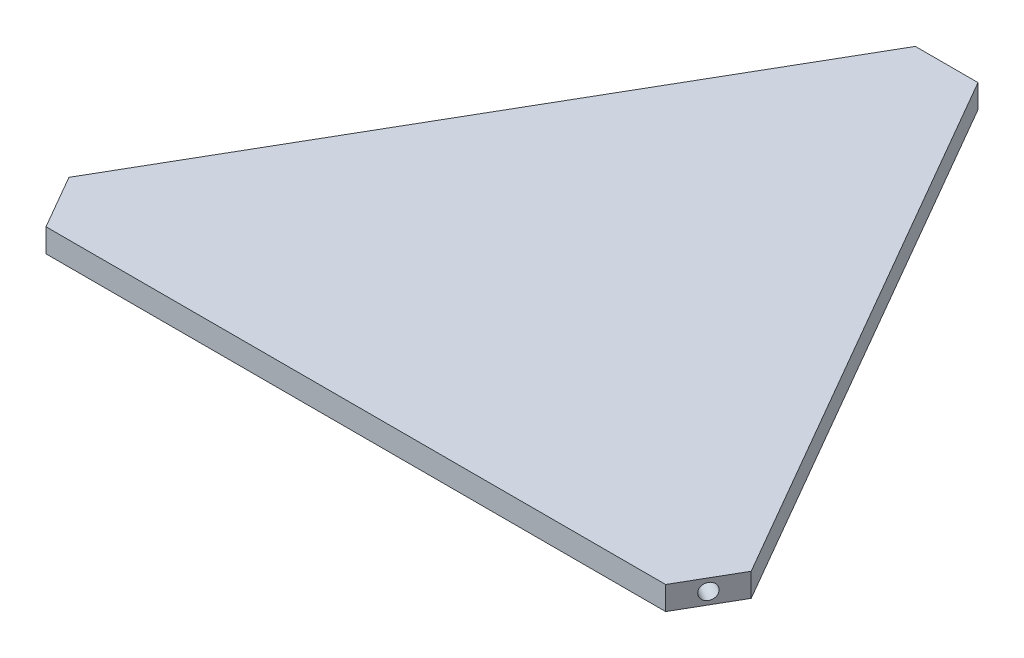
ISO-10303-21;
HEADER;
FILE_DESCRIPTION(('STEP AP214'),'2;1');
FILE_NAME('part.step','',(''),(''),'','','');
FILE_SCHEMA(('AUTOMOTIVE_DESIGN { 1 0 10303 214 1 1 1 1 }'));
ENDSEC;
DATA;
#1=APPLICATION_CONTEXT('core data for automotive mechanical design processes');
#2=APPLICATION_PROTOCOL_DEFINITION('international standard','automotive_design',2000,#1);
#3=PRODUCT_CONTEXT('',#1,'mechanical');
#4=PRODUCT('Part','Part','',(#3));
#5=PRODUCT_RELATED_PRODUCT_CATEGORY('part','',(#4));
#6=PRODUCT_DEFINITION_FORMATION('','',#4);
#7=PRODUCT_DEFINITION_CONTEXT('part definition',#1,'design');
#8=PRODUCT_DEFINITION('design','',#6,#7);
#9=PRODUCT_DEFINITION_SHAPE('','',#8);
#10=(LENGTH_UNIT() NAMED_UNIT(*) SI_UNIT(.MILLI.,.METRE.));
#11=(NAMED_UNIT(*) PLANE_ANGLE_UNIT() SI_UNIT($,.RADIAN.));
#12=(NAMED_UNIT(*) SI_UNIT($,.STERADIAN.) SOLID_ANGLE_UNIT());
#13=UNCERTAINTY_MEASURE_WITH_UNIT(LENGTH_MEASURE(1.E-05),#10,'distance_accuracy_value','');
#14=(GEOMETRIC_REPRESENTATION_CONTEXT(3) GLOBAL_UNCERTAINTY_ASSIGNED_CONTEXT((#13)) GLOBAL_UNIT_ASSIGNED_CONTEXT((#10,
#11,#12)) REPRESENTATION_CONTEXT('',''));
#15=CARTESIAN_POINT('',(0.,0.,0.));
#16=DIRECTION('',(0.,0.,1.));
#17=DIRECTION('',(1.,0.,0.));
#18=AXIS2_PLACEMENT_3D('',#15,#16,#17);
#19=CARTESIAN_POINT('',(12.7,4.7625,-152.4));
#20=DIRECTION('',(0.,0.,1.));
#21=DIRECTION('',(1.,0.,0.));
#22=AXIS2_PLACEMENT_3D('',#19,#20,#21);
#23=PLANE('',#22);
#24=CARTESIAN_POINT('',(-1.0547118733939E-12,0.,-152.4));
#25=DIRECTION('',(0.,0.,-1.));
#26=DIRECTION('',(-1.,0.,0.));
#27=AXIS2_PLACEMENT_3D('',#24,#25,#26);
#28=CIRCLE('',#27,3.17499999999999);
#29=CARTESIAN_POINT('',(-3.17500000000104,0.,-152.4));
#30=VERTEX_POINT('',#29);
#31=EDGE_CURVE('E165',#30,#30,#28,.T.);
#32=ORIENTED_EDGE('',*,*,#31,.F.);
#33=EDGE_LOOP('',(#32));
#34=FACE_BOUND('',#33,.T.);
#35=DIRECTION('',(-1.,0.,0.));
#36=VECTOR('',#35,1.);
#37=CARTESIAN_POINT('',(12.7,-4.7625,-152.4));
#38=LINE('',#37,#36);
#39=CARTESIAN_POINT('',(12.7,-4.7625,-152.4));
#40=VERTEX_POINT('',#39);
#41=CARTESIAN_POINT('',(-12.7,-4.7625,-152.4));
#42=VERTEX_POINT('',#41);
#43=EDGE_CURVE('E122',#40,#42,#38,.T.);
#44=ORIENTED_EDGE('',*,*,#43,.T.);
#45=DIRECTION('',(0.,-1.,0.));
#46=VECTOR('',#45,1.);
#47=CARTESIAN_POINT('',(-12.7,4.7625,-152.4));
#48=LINE('',#47,#46);
#49=CARTESIAN_POINT('',(-12.7,4.7625,-152.4));
#50=VERTEX_POINT('',#49);
#51=EDGE_CURVE('E11',#50,#42,#48,.T.);
#52=ORIENTED_EDGE('',*,*,#51,.F.);
#53=DIRECTION('',(-1.,0.,0.));
#54=VECTOR('',#53,1.);
#55=CARTESIAN_POINT('',(12.7,4.7625,-152.4));
#56=LINE('',#55,#54);
#57=CARTESIAN_POINT('',(12.7,4.7625,-152.4));
#58=VERTEX_POINT('',#57);
#59=EDGE_CURVE('E133',#58,#50,#56,.T.);
#60=ORIENTED_EDGE('',*,*,#59,.F.);
#61=DIRECTION('',(0.,-1.,0.));
#62=VECTOR('',#61,1.);
#63=CARTESIAN_POINT('',(12.7,4.7625,-152.4));
#64=LINE('',#63,#62);
#65=EDGE_CURVE('E118',#58,#40,#64,.T.);
#66=ORIENTED_EDGE('',*,*,#65,.T.);
#67=EDGE_LOOP('',(#44,#52,#60,#66));
#68=FACE_BOUND('',#67,.T.);
#69=ADVANCED_FACE('F35',(#34,#68),#23,.F.);
#70=CARTESIAN_POINT('',(-12.7,4.7625,-152.4));
#71=DIRECTION('',(0.866025403784438,0.,0.500000000000001));
#72=DIRECTION('',(0.500000000000001,0.,-0.866025403784438));
#73=AXIS2_PLACEMENT_3D('',#70,#71,#72);
#74=PLANE('',#73);
#75=DIRECTION('',(-0.500000000000001,0.,0.866025403784438));
#76=VECTOR('',#75,1.);
#77=CARTESIAN_POINT('',(-12.7,-4.7625,-152.4));
#78=LINE('',#77,#76);
#79=CARTESIAN_POINT('',(-138.332271536749,-4.7625,65.2014773719373));
#80=VERTEX_POINT('',#79);
#81=EDGE_CURVE('E125',#42,#80,#78,.T.);
#82=ORIENTED_EDGE('',*,*,#81,.T.);
#83=DIRECTION('',(0.,-1.,0.));
#84=VECTOR('',#83,1.);
#85=CARTESIAN_POINT('',(-138.332271536749,4.7625,65.2014773719373));
#86=LINE('',#85,#84);
#87=CARTESIAN_POINT('',(-138.332271536749,4.7625,65.2014773719373));
#88=VERTEX_POINT('',#87);
#89=EDGE_CURVE('E43',#88,#80,#86,.T.);
#90=ORIENTED_EDGE('',*,*,#89,.F.);
#91=DIRECTION('',(-0.500000000000001,0.,0.866025403784438));
#92=VECTOR('',#91,1.);
#93=CARTESIAN_POINT('',(-12.7,4.7625,-152.4));
#94=LINE('',#93,#92);
#95=EDGE_CURVE('E89',#50,#88,#94,.T.);
#96=ORIENTED_EDGE('',*,*,#95,.F.);
#97=ORIENTED_EDGE('',*,*,#51,.T.);
#98=EDGE_LOOP('',(#82,#90,#96,#97));
#99=FACE_BOUND('',#98,.T.);
#100=ADVANCED_FACE('F158',(#99),#74,.F.);
#101=CARTESIAN_POINT('',(-138.332271536749,4.7625,65.2014773719373));
#102=DIRECTION('',(0.86602540378444,0.,-0.499999999999998));
#103=DIRECTION('',(-0.499999999999998,0.,-0.86602540378444));
#104=AXIS2_PLACEMENT_3D('',#101,#102,#103);
#105=PLANE('',#104);
#106=CARTESIAN_POINT('',(-131.982271536748,0.,76.2000000000015));
#107=DIRECTION('',(-0.866025403784433,0.,0.50000000000001));
#108=DIRECTION('',(0.50000000000001,0.,0.866025403784433));
#109=AXIS2_PLACEMENT_3D('',#106,#107,#108);
#110=CIRCLE('',#109,3.17499999999999);
#111=CARTESIAN_POINT('',(-130.394771536748,0.,78.9496306570171));
#112=VERTEX_POINT('',#111);
#113=EDGE_CURVE('E174',#112,#112,#110,.T.);
#114=ORIENTED_EDGE('',*,*,#113,.F.);
#115=EDGE_LOOP('',(#114));
#116=FACE_BOUND('',#115,.T.);
#117=DIRECTION('',(0.499999999999998,0.,0.86602540378444));
#118=VECTOR('',#117,1.);
#119=CARTESIAN_POINT('',(-138.332271536749,-4.7625,65.2014773719373));
#120=LINE('',#119,#118);
#121=CARTESIAN_POINT('',(-125.632271536749,-4.7625,87.1985226280621));
#122=VERTEX_POINT('',#121);
#123=EDGE_CURVE('E128',#80,#122,#120,.T.);
#124=ORIENTED_EDGE('',*,*,#123,.T.);
#125=DIRECTION('',(0.,-1.,0.));
#126=VECTOR('',#125,1.);
#127=CARTESIAN_POINT('',(-125.632271536749,4.7625,87.1985226280621));
#128=LINE('',#127,#126);
#129=CARTESIAN_POINT('',(-125.632271536749,4.7625,87.1985226280621));
#130=VERTEX_POINT('',#129);
#131=EDGE_CURVE('E113',#130,#122,#128,.T.);
#132=ORIENTED_EDGE('',*,*,#131,.F.);
#133=DIRECTION('',(0.499999999999998,0.,0.86602540378444));
#134=VECTOR('',#133,1.);
#135=CARTESIAN_POINT('',(-138.332271536749,4.7625,65.2014773719373));
#136=LINE('',#135,#134);
#137=EDGE_CURVE('E104',#88,#130,#136,.T.);
#138=ORIENTED_EDGE('',*,*,#137,.F.);
#139=ORIENTED_EDGE('',*,*,#89,.T.);
#140=EDGE_LOOP('',(#124,#132,#138,#139));
#141=FACE_BOUND('',#140,.T.);
#142=ADVANCED_FACE('F139',(#116,#141),#105,.F.);
#143=CARTESIAN_POINT('',(-125.632271536749,4.7625,87.1985226280621));
#144=DIRECTION('',(0.,0.,-1.));
#145=DIRECTION('',(-1.,0.,0.));
#146=AXIS2_PLACEMENT_3D('',#143,#144,#145);
#147=PLANE('',#146);
#148=DIRECTION('',(1.,0.,0.));
#149=VECTOR('',#148,1.);
#150=CARTESIAN_POINT('',(-125.632271536749,-4.7625,87.1985226280621));
#151=LINE('',#150,#149);
#152=CARTESIAN_POINT('',(125.632271536749,-4.7625,87.1985226280621));
#153=VERTEX_POINT('',#152);
#154=EDGE_CURVE('E112',#122,#153,#151,.T.);
#155=ORIENTED_EDGE('',*,*,#154,.T.);
#156=DIRECTION('',(0.,-1.,0.));
#157=VECTOR('',#156,1.);
#158=CARTESIAN_POINT('',(125.632271536749,4.7625,87.1985226280621));
#159=LINE('',#158,#157);
#160=CARTESIAN_POINT('',(125.632271536749,4.7625,87.1985226280621));
#161=VERTEX_POINT('',#160);
#162=EDGE_CURVE('E109',#161,#153,#159,.T.);
#163=ORIENTED_EDGE('',*,*,#162,.F.);
#164=DIRECTION('',(1.,0.,0.));
#165=VECTOR('',#164,1.);
#166=CARTESIAN_POINT('',(-125.632271536749,4.7625,87.1985226280621));
#167=LINE('',#166,#165);
#168=EDGE_CURVE('E98',#130,#161,#167,.T.);
#169=ORIENTED_EDGE('',*,*,#168,.F.);
#170=ORIENTED_EDGE('',*,*,#131,.T.);
#171=EDGE_LOOP('',(#155,#163,#169,#170));
#172=FACE_BOUND('',#171,.T.);
#173=ADVANCED_FACE('F110',(#172),#147,.F.);
#174=CARTESIAN_POINT('',(138.332271536749,4.7625,65.2014773719373));
#175=DIRECTION('',(-0.86602540378444,0.,-0.499999999999998));
#176=DIRECTION('',(-0.499999999999998,0.,0.86602540378444));
#177=AXIS2_PLACEMENT_3D('',#174,#175,#176);
#178=PLANE('',#177);
#179=CARTESIAN_POINT('',(131.982271536749,0.,76.1999999999997));
#180=DIRECTION('',(0.86602540378444,0.,0.499999999999998));
#181=DIRECTION('',(0.499999999999998,0.,-0.86602540378444));
#182=AXIS2_PLACEMENT_3D('',#179,#180,#181);
#183=CIRCLE('',#182,3.17499999999999);
#184=CARTESIAN_POINT('',(133.569771536749,0.,73.4503693429841));
#185=VERTEX_POINT('',#184);
#186=EDGE_CURVE('E171',#185,#185,#183,.T.);
#187=ORIENTED_EDGE('',*,*,#186,.F.);
#188=EDGE_LOOP('',(#187));
#189=FACE_BOUND('',#188,.T.);
#190=DIRECTION('',(0.499999999999998,0.,-0.86602540378444));
#191=VECTOR('',#190,1.);
#192=CARTESIAN_POINT('',(138.332271536749,-4.7625,65.2014773719373));
#193=LINE('',#192,#191);
#194=CARTESIAN_POINT('',(138.332271536749,-4.7625,65.2014773719373));
#195=VERTEX_POINT('',#194);
#196=EDGE_CURVE('E75',#153,#195,#193,.T.);
#197=ORIENTED_EDGE('',*,*,#196,.T.);
#198=DIRECTION('',(0.,-1.,0.));
#199=VECTOR('',#198,1.);
#200=CARTESIAN_POINT('',(138.332271536749,4.7625,65.2014773719373));
#201=LINE('',#200,#199);
#202=CARTESIAN_POINT('',(138.332271536749,4.7625,65.2014773719373));
#203=VERTEX_POINT('',#202);
#204=EDGE_CURVE('E114',#203,#195,#201,.T.);
#205=ORIENTED_EDGE('',*,*,#204,.F.);
#206=DIRECTION('',(0.499999999999998,0.,-0.86602540378444));
#207=VECTOR('',#206,1.);
#208=CARTESIAN_POINT('',(138.332271536749,4.7625,65.2014773719373));
#209=LINE('',#208,#207);
#210=EDGE_CURVE('E102',#161,#203,#209,.T.);
#211=ORIENTED_EDGE('',*,*,#210,.F.);
#212=ORIENTED_EDGE('',*,*,#162,.T.);
#213=EDGE_LOOP('',(#197,#205,#211,#212));
#214=FACE_BOUND('',#213,.T.);
#215=ADVANCED_FACE('F116',(#189,#214),#178,.F.);
#216=CARTESIAN_POINT('',(138.332271536749,4.7625,65.2014773719373));
#217=DIRECTION('',(-0.866025403784438,0.,0.500000000000001));
#218=DIRECTION('',(0.500000000000001,0.,0.866025403784438));
#219=AXIS2_PLACEMENT_3D('',#216,#217,#218);
#220=PLANE('',#219);
#221=DIRECTION('',(-0.500000000000001,0.,-0.866025403784438));
#222=VECTOR('',#221,1.);
#223=CARTESIAN_POINT('',(138.332271536749,-4.7625,65.2014773719373));
#224=LINE('',#223,#222);
#225=EDGE_CURVE('E81',#195,#40,#224,.T.);
#226=ORIENTED_EDGE('',*,*,#225,.T.);
#227=ORIENTED_EDGE('',*,*,#65,.F.);
#228=DIRECTION('',(-0.500000000000001,0.,-0.866025403784438));
#229=VECTOR('',#228,1.);
#230=CARTESIAN_POINT('',(138.332271536749,4.7625,65.2014773719373));
#231=LINE('',#230,#229);
#232=EDGE_CURVE('E51',#203,#58,#231,.T.);
#233=ORIENTED_EDGE('',*,*,#232,.F.);
#234=ORIENTED_EDGE('',*,*,#204,.T.);
#235=EDGE_LOOP('',(#226,#227,#233,#234));
#236=FACE_BOUND('',#235,.T.);
#237=ADVANCED_FACE('F146',(#236),#220,.F.);
#238=CARTESIAN_POINT('',(0.,4.7625,0.));
#239=DIRECTION('',(0.,1.,0.));
#240=DIRECTION('',(0.,0.,1.));
#241=AXIS2_PLACEMENT_3D('',#238,#239,#240);
#242=PLANE('',#241);
#243=ORIENTED_EDGE('',*,*,#59,.T.);
#244=ORIENTED_EDGE('',*,*,#95,.T.);
#245=ORIENTED_EDGE('',*,*,#137,.T.);
#246=ORIENTED_EDGE('',*,*,#168,.T.);
#247=ORIENTED_EDGE('',*,*,#210,.T.);
#248=ORIENTED_EDGE('',*,*,#232,.T.);
#249=EDGE_LOOP('',(#243,#244,#245,#246,#247,#248));
#250=FACE_BOUND('',#249,.T.);
#251=ADVANCED_FACE('F100',(#250),#242,.T.);
#252=CARTESIAN_POINT('',(0.,-4.7625,0.));
#253=DIRECTION('',(0.,1.,0.));
#254=DIRECTION('',(0.,0.,1.));
#255=AXIS2_PLACEMENT_3D('',#252,#253,#254);
#256=PLANE('',#255);
#257=ORIENTED_EDGE('',*,*,#43,.F.);
#258=ORIENTED_EDGE('',*,*,#225,.F.);
#259=ORIENTED_EDGE('',*,*,#196,.F.);
#260=ORIENTED_EDGE('',*,*,#154,.F.);
#261=ORIENTED_EDGE('',*,*,#123,.F.);
#262=ORIENTED_EDGE('',*,*,#81,.F.);
#263=EDGE_LOOP('',(#257,#258,#259,#260,#261,#262));
#264=FACE_BOUND('',#263,.T.);
#265=ADVANCED_FACE('F142',(#264),#256,.F.);
#266=CARTESIAN_POINT('',(120.983748908686,0.,69.8499999999997));
#267=DIRECTION('',(0.86602540378444,0.,0.499999999999998));
#268=DIRECTION('',(0.499999999999998,0.,-0.86602540378444));
#269=AXIS2_PLACEMENT_3D('',#266,#267,#268);
#270=CONICAL_SURFACE('',#269,3.17499999999999,1.02974425867666);
#271=CARTESIAN_POINT('',(119.331604130015,0.,68.8961337672935));
#272=VERTEX_POINT('',#271);
#273=VERTEX_LOOP('',#272);
#274=FACE_BOUND('',#273,.T.);
#275=CARTESIAN_POINT('',(120.983748908686,0.,69.8499999999997));
#276=DIRECTION('',(0.86602540378444,0.,0.499999999999998));
#277=DIRECTION('',(0.499999999999998,0.,-0.86602540378444));
#278=AXIS2_PLACEMENT_3D('',#275,#276,#277);
#279=CIRCLE('',#278,3.17499999999999);
#280=CARTESIAN_POINT('',(122.571248908686,0.,67.1003693429842));
#281=VERTEX_POINT('',#280);
#282=EDGE_CURVE('E126',#281,#281,#279,.T.);
#283=ORIENTED_EDGE('',*,*,#282,.T.);
#284=EDGE_LOOP('',(#283));
#285=FACE_BOUND('',#284,.T.);
#286=ADVANCED_FACE('F185',(#274,#285),#270,.F.);
#287=CARTESIAN_POINT('',(131.982271536749,0.,76.1999999999997));
#288=DIRECTION('',(0.86602540378444,0.,0.499999999999998));
#289=DIRECTION('',(0.499999999999998,0.,-0.86602540378444));
#290=AXIS2_PLACEMENT_3D('',#287,#288,#289);
#291=CYLINDRICAL_SURFACE('',#290,3.17499999999999);
#292=CARTESIAN_POINT('',(122.571248908686,0.,67.1003693429842));
#293=CARTESIAN_POINT('',(122.685816852729,0.,67.1665151763175));
#294=CARTESIAN_POINT('',(122.800384796771,0.,67.2326610096508));
#295=CARTESIAN_POINT('',(123.029520684856,0.,67.3649526763175));
#296=CARTESIAN_POINT('',(123.144088628898,0.,67.4310985096508));
#297=CARTESIAN_POINT('',(123.373224516982,0.,67.5633901763175));
#298=CARTESIAN_POINT('',(123.487792461025,0.,67.6295360096508));
#299=CARTESIAN_POINT('',(123.716928349109,0.,67.7618276763175));
#300=CARTESIAN_POINT('',(123.831496293152,0.,67.8279735096508));
#301=CARTESIAN_POINT('',(124.060632181236,0.,67.9602651763175));
#302=CARTESIAN_POINT('',(124.175200125279,0.,68.0264110096508));
#303=CARTESIAN_POINT('',(124.404336013363,0.,68.1587026763175));
#304=CARTESIAN_POINT('',(124.518903957406,0.,68.2248485096508));
#305=CARTESIAN_POINT('',(124.74803984549,0.,68.3571401763175));
#306=CARTESIAN_POINT('',(124.862607789533,0.,68.4232860096508));
#307=CARTESIAN_POINT('',(125.091743677617,0.,68.5555776763175));
#308=CARTESIAN_POINT('',(125.20631162166,0.,68.6217235096508));
#309=CARTESIAN_POINT('',(125.435447509744,0.,68.7540151763175));
#310=CARTESIAN_POINT('',(125.550015453786,0.,68.8201610096508));
#311=CARTESIAN_POINT('',(125.779151341871,0.,68.9524526763175));
#312=CARTESIAN_POINT('',(125.893719285913,0.,69.0185985096508));
#313=CARTESIAN_POINT('',(126.122855173998,0.,69.1508901763175));
#314=CARTESIAN_POINT('',(126.23742311804,0.,69.2170360096508));
#315=CARTESIAN_POINT('',(126.466559006125,0.,69.3493276763175));
#316=CARTESIAN_POINT('',(126.581126950167,0.,69.4154735096508));
#317=CARTESIAN_POINT('',(126.810262838252,0.,69.5477651763175));
#318=CARTESIAN_POINT('',(126.924830782294,0.,69.6139110096508));
#319=CARTESIAN_POINT('',(127.153966670379,0.,69.7462026763175));
#320=CARTESIAN_POINT('',(127.268534614421,0.,69.8123485096508));
#321=CARTESIAN_POINT('',(127.497670502506,0.,69.9446401763175));
#322=CARTESIAN_POINT('',(127.612238446548,0.,70.0107860096508));
#323=CARTESIAN_POINT('',(127.841374334633,0.,70.1430776763175));
#324=CARTESIAN_POINT('',(127.955942278675,0.,70.2092235096508));
#325=CARTESIAN_POINT('',(128.18507816676,0.,70.3415151763175));
#326=CARTESIAN_POINT('',(128.299646110802,0.,70.4076610096508));
#327=CARTESIAN_POINT('',(128.528781998887,0.,70.5399526763175));
#328=CARTESIAN_POINT('',(128.643349942929,0.,70.6060985096508));
#329=CARTESIAN_POINT('',(128.872485831014,0.,70.7383901763175));
#330=CARTESIAN_POINT('',(128.987053775056,0.,70.8045360096508));
#331=CARTESIAN_POINT('',(129.216189663141,0.,70.9368276763175));
#332=CARTESIAN_POINT('',(129.330757607183,0.,71.0029735096508));
#333=CARTESIAN_POINT('',(129.559893495268,0.,71.1352651763175));
#334=CARTESIAN_POINT('',(129.67446143931,0.,71.2014110096508));
#335=CARTESIAN_POINT('',(129.903597327395,0.,71.3337026763175));
#336=CARTESIAN_POINT('',(130.018165271437,0.,71.3998485096508));
#337=CARTESIAN_POINT('',(130.247301159521,0.,71.5321401763175));
#338=CARTESIAN_POINT('',(130.361869103564,0.,71.5982860096508));
#339=CARTESIAN_POINT('',(130.591004991648,0.,71.7305776763175));
#340=CARTESIAN_POINT('',(130.705572935691,0.,71.7967235096508));
#341=CARTESIAN_POINT('',(130.934708823775,0.,71.9290151763175));
#342=CARTESIAN_POINT('',(131.049276767818,0.,71.9951610096508));
#343=CARTESIAN_POINT('',(131.278412655902,0.,72.1274526763175));
#344=CARTESIAN_POINT('',(131.392980599945,0.,72.1935985096508));
#345=CARTESIAN_POINT('',(131.622116488029,0.,72.3258901763175));
#346=CARTESIAN_POINT('',(131.736684432072,0.,72.3920360096508));
#347=CARTESIAN_POINT('',(131.965820320156,0.,72.5243276763175));
#348=CARTESIAN_POINT('',(132.080388264199,0.,72.5904735096508));
#349=CARTESIAN_POINT('',(132.309524152283,0.,72.7227651763175));
#350=CARTESIAN_POINT('',(132.424092096325,0.,72.7889110096508));
#351=CARTESIAN_POINT('',(132.65322798441,0.,72.9212026763175));
#352=CARTESIAN_POINT('',(132.767795928452,0.,72.9873485096508));
#353=CARTESIAN_POINT('',(132.996931816537,0.,73.1196401763175));
#354=CARTESIAN_POINT('',(133.111499760579,0.,73.1857860096508));
#355=CARTESIAN_POINT('',(133.340635648664,0.,73.3180776763175));
#356=CARTESIAN_POINT('',(133.455203592706,0.,73.3842235096508));
#357=CARTESIAN_POINT('',(133.569771536749,0.,73.4503693429841));
#358=B_SPLINE_CURVE_WITH_KNOTS('',3,(#292,#293,#294,#295,#296,#297,#298,#299,#300,#301,#302,
#303,#304,#305,#306,#307,#308,#309,#310,#311,#312,#313,#314,#315,#316,#317,#318,#319,#320,#321,
#322,#323,#324,#325,#326,#327,#328,#329,#330,#331,#332,#333,#334,#335,#336,#337,#338,#339,#340,
#341,#342,#343,#344,#345,#346,#347,#348,#349,#350,#351,#352,#353,#354,#355,#356,#357),
.UNSPECIFIED.,.F.,.F.,(4,2,2,2,2,2,2,2,2,2,2,2,2,2,2,2,2,2,2,2,2,2,2,2,2,2,2,2,2,2,2,2,4),(0.,
0.396875,0.79375,1.19062500000001,1.58750000000001,1.98437500000001,2.38125000000001,2.778125,
3.175,3.571875,3.96875000000001,4.36562500000001,4.76250000000001,5.15937500000001,
5.55625000000001,5.95312500000001,6.35000000000001,6.74687500000001,7.14374999999999,
7.54062499999999,7.93749999999999,8.334375,8.73125,9.128125,9.525,9.92187500000001,10.31875,
10.715625,11.1125,11.509375,11.90625,12.303125,12.7),.UNSPECIFIED.);
#359=EDGE_CURVE('BSEAM187',#281,#185,#358,.T.);
#360=ORIENTED_EDGE('',*,*,#282,.F.);
#361=ORIENTED_EDGE('',*,*,#186,.T.);
#362=ORIENTED_EDGE('',*,*,#359,.T.);
#363=ORIENTED_EDGE('',*,*,#359,.F.);
#364=EDGE_LOOP('',(#360,#362,#361,#363));
#365=FACE_BOUND('',#364,.T.);
#366=ADVANCED_FACE('F187',(#365),#291,.F.);
#367=CARTESIAN_POINT('',(-1.0547118733939E-12,0.,-139.7));
#368=DIRECTION('',(0.,0.,-1.));
#369=DIRECTION('',(-1.,0.,0.));
#370=AXIS2_PLACEMENT_3D('',#367,#368,#369);
#371=CONICAL_SURFACE('',#370,3.17499999999999,1.02974425867666);
#372=CARTESIAN_POINT('',(-1.05828973595521E-12,0.,-137.792267534588));
#373=VERTEX_POINT('',#372);
#374=VERTEX_LOOP('',#373);
#375=FACE_BOUND('',#374,.T.);
#376=CARTESIAN_POINT('',(-1.0547118733939E-12,0.,-139.7));
#377=DIRECTION('',(0.,0.,-1.));
#378=DIRECTION('',(-1.,0.,0.));
#379=AXIS2_PLACEMENT_3D('',#376,#377,#378);
#380=CIRCLE('',#379,3.17499999999999);
#381=CARTESIAN_POINT('',(-3.17500000000104,0.,-139.7));
#382=VERTEX_POINT('',#381);
#383=EDGE_CURVE('E167',#382,#382,#380,.T.);
#384=ORIENTED_EDGE('',*,*,#383,.T.);
#385=EDGE_LOOP('',(#384));
#386=FACE_BOUND('',#385,.T.);
#387=ADVANCED_FACE('F190',(#375,#386),#371,.F.);
#388=CARTESIAN_POINT('',(-1.0547118733939E-12,0.,-152.4));
#389=DIRECTION('',(0.,0.,-1.));
#390=DIRECTION('',(-1.,0.,0.));
#391=AXIS2_PLACEMENT_3D('',#388,#389,#390);
#392=CYLINDRICAL_SURFACE('',#391,3.17499999999999);
#393=ORIENTED_EDGE('',*,*,#383,.F.);
#394=EDGE_LOOP('',(#393));
#395=FACE_BOUND('',#394,.T.);
#396=ORIENTED_EDGE('',*,*,#31,.T.);
#397=EDGE_LOOP('',(#396));
#398=FACE_BOUND('',#397,.T.);
#399=ADVANCED_FACE('F197',(#395,#398),#392,.F.);
#400=CARTESIAN_POINT('',(-120.983748908685,0.,69.8500000000014));
#401=DIRECTION('',(-0.866025403784433,0.,0.50000000000001));
#402=DIRECTION('',(0.50000000000001,0.,0.866025403784433));
#403=AXIS2_PLACEMENT_3D('',#400,#401,#402);
#404=CONICAL_SURFACE('',#403,3.17499999999999,1.02974425867666);
#405=CARTESIAN_POINT('',(-119.331604130014,0.,68.8961337672952));
#406=VERTEX_POINT('',#405);
#407=VERTEX_LOOP('',#406);
#408=FACE_BOUND('',#407,.T.);
#409=CARTESIAN_POINT('',(-120.983748908685,0.,69.8500000000014));
#410=DIRECTION('',(-0.866025403784433,0.,0.50000000000001));
#411=DIRECTION('',(0.50000000000001,0.,0.866025403784433));
#412=AXIS2_PLACEMENT_3D('',#409,#410,#411);
#413=CIRCLE('',#412,3.17499999999999);
#414=CARTESIAN_POINT('',(-119.396248908685,0.,72.599630657017));
#415=VERTEX_POINT('',#414);
#416=EDGE_CURVE('E168',#415,#415,#413,.T.);
#417=ORIENTED_EDGE('',*,*,#416,.T.);
#418=EDGE_LOOP('',(#417));
#419=FACE_BOUND('',#418,.T.);
#420=ADVANCED_FACE('F250',(#408,#419),#404,.F.);
#421=CARTESIAN_POINT('',(-131.982271536748,0.,76.2000000000015));
#422=DIRECTION('',(-0.866025403784433,0.,0.50000000000001));
#423=DIRECTION('',(0.50000000000001,0.,0.866025403784433));
#424=AXIS2_PLACEMENT_3D('',#421,#422,#423);
#425=CYLINDRICAL_SURFACE('',#424,3.17499999999999);
#426=CARTESIAN_POINT('',(-119.396248908685,0.,72.599630657017));
#427=CARTESIAN_POINT('',(-119.510816852728,0.,72.6657764903503));
#428=CARTESIAN_POINT('',(-119.62538479677,0.,72.7319223236836));
#429=CARTESIAN_POINT('',(-119.854520684854,0.,72.8642139903503));
#430=CARTESIAN_POINT('',(-119.969088628897,0.,72.9303598236836));
#431=CARTESIAN_POINT('',(-120.198224516981,0.,73.0626514903503));
#432=CARTESIAN_POINT('',(-120.312792461024,0.,73.1287973236837));
#433=CARTESIAN_POINT('',(-120.541928349108,0.,73.2610889903503));
#434=CARTESIAN_POINT('',(-120.656496293151,0.,73.3272348236837));
#435=CARTESIAN_POINT('',(-120.885632181235,0.,73.4595264903503));
#436=CARTESIAN_POINT('',(-121.000200125278,0.,73.5256723236837));
#437=CARTESIAN_POINT('',(-121.229336013362,0.,73.6579639903503));
#438=CARTESIAN_POINT('',(-121.343903957405,0.,73.7241098236837));
#439=CARTESIAN_POINT('',(-121.573039845489,0.,73.8564014903503));
#440=CARTESIAN_POINT('',(-121.687607789532,0.,73.9225473236837));
#441=CARTESIAN_POINT('',(-121.916743677616,0.,74.0548389903503));
#442=CARTESIAN_POINT('',(-122.031311621659,0.,74.1209848236837));
#443=CARTESIAN_POINT('',(-122.260447509743,0.,74.2532764903503));
#444=CARTESIAN_POINT('',(-122.375015453785,0.,74.3194223236837));
#445=CARTESIAN_POINT('',(-122.60415134187,0.,74.4517139903503));
#446=CARTESIAN_POINT('',(-122.718719285912,0.,74.5178598236837));
#447=CARTESIAN_POINT('',(-122.947855173997,0.,74.6501514903504));
#448=CARTESIAN_POINT('',(-123.062423118039,0.,74.7162973236837));
#449=CARTESIAN_POINT('',(-123.291559006124,0.,74.8485889903504));
#450=CARTESIAN_POINT('',(-123.406126950166,0.,74.9147348236837));
#451=CARTESIAN_POINT('',(-123.635262838251,0.,75.0470264903504));
#452=CARTESIAN_POINT('',(-123.749830782293,0.,75.1131723236837));
#453=CARTESIAN_POINT('',(-123.978966670378,0.,75.2454639903504));
#454=CARTESIAN_POINT('',(-124.09353461442,0.,75.3116098236837));
#455=CARTESIAN_POINT('',(-124.322670502505,0.,75.4439014903504));
#456=CARTESIAN_POINT('',(-124.437238446547,0.,75.5100473236837));
#457=CARTESIAN_POINT('',(-124.666374334632,0.,75.6423389903504));
#458=CARTESIAN_POINT('',(-124.780942278674,0.,75.7084848236837));
#459=CARTESIAN_POINT('',(-125.010078166759,0.,75.8407764903504));
#460=CARTESIAN_POINT('',(-125.124646110801,0.,75.9069223236837));
#461=CARTESIAN_POINT('',(-125.353781998886,0.,76.0392139903504));
#462=CARTESIAN_POINT('',(-125.468349942928,0.,76.1053598236837));
#463=CARTESIAN_POINT('',(-125.697485831013,0.,76.2376514903504));
#464=CARTESIAN_POINT('',(-125.812053775055,0.,76.3037973236837));
#465=CARTESIAN_POINT('',(-126.04118966314,0.,76.4360889903504));
#466=CARTESIAN_POINT('',(-126.155757607182,0.,76.5022348236837));
#467=CARTESIAN_POINT('',(-126.384893495266,0.,76.6345264903504));
#468=CARTESIAN_POINT('',(-126.499461439309,0.,76.7006723236837));
#469=CARTESIAN_POINT('',(-126.728597327393,0.,76.8329639903504));
#470=CARTESIAN_POINT('',(-126.843165271436,0.,76.8991098236837));
#471=CARTESIAN_POINT('',(-127.07230115952,0.,77.0314014903504));
#472=CARTESIAN_POINT('',(-127.186869103563,0.,77.0975473236837));
#473=CARTESIAN_POINT('',(-127.416004991647,0.,77.2298389903504));
#474=CARTESIAN_POINT('',(-127.53057293569,0.,77.2959848236837));
#475=CARTESIAN_POINT('',(-127.759708823774,0.,77.4282764903504));
#476=CARTESIAN_POINT('',(-127.874276767817,0.,77.4944223236837));
#477=CARTESIAN_POINT('',(-128.103412655901,0.,77.6267139903504));
#478=CARTESIAN_POINT('',(-128.217980599944,0.,77.6928598236837));
#479=CARTESIAN_POINT('',(-128.447116488028,0.,77.8251514903504));
#480=CARTESIAN_POINT('',(-128.56168443207,0.,77.8912973236837));
#481=CARTESIAN_POINT('',(-128.790820320155,0.,78.0235889903504));
#482=CARTESIAN_POINT('',(-128.905388264197,0.,78.0897348236838));
#483=CARTESIAN_POINT('',(-129.134524152282,0.,78.2220264903504));
#484=CARTESIAN_POINT('',(-129.249092096324,0.,78.2881723236838));
#485=CARTESIAN_POINT('',(-129.478227984409,0.,78.4204639903504));
#486=CARTESIAN_POINT('',(-129.592795928451,0.,78.4866098236838));
#487=CARTESIAN_POINT('',(-129.821931816536,0.,78.6189014903504));
#488=CARTESIAN_POINT('',(-129.936499760578,0.,78.6850473236838));
#489=CARTESIAN_POINT('',(-130.165635648663,0.,78.8173389903504));
#490=CARTESIAN_POINT('',(-130.280203592705,0.,78.8834848236838));
#491=CARTESIAN_POINT('',(-130.394771536748,0.,78.9496306570171));
#492=B_SPLINE_CURVE_WITH_KNOTS('',3,(#426,#427,#428,#429,#430,#431,#432,#433,#434,#435,#436,
#437,#438,#439,#440,#441,#442,#443,#444,#445,#446,#447,#448,#449,#450,#451,#452,#453,#454,#455,
#456,#457,#458,#459,#460,#461,#462,#463,#464,#465,#466,#467,#468,#469,#470,#471,#472,#473,#474,
#475,#476,#477,#478,#479,#480,#481,#482,#483,#484,#485,#486,#487,#488,#489,#490,#491),
.UNSPECIFIED.,.F.,.F.,(4,2,2,2,2,2,2,2,2,2,2,2,2,2,2,2,2,2,2,2,2,2,2,2,2,2,2,2,2,2,2,2,4),(0.,
0.396874999999988,0.793749999999994,1.19062499999999,1.58749999999999,1.984375,2.38125,
2.77812499999999,3.175,3.571875,3.96874999999999,4.365625,4.7625,5.15937499999999,
5.55624999999999,5.953125,6.34999999999999,6.74687499999999,7.14375,7.540625,7.93750000000001,
8.33437499999999,8.73124999999999,9.12812499999999,9.525,9.921875,10.31875,10.715625,11.1125,
11.509375,11.90625,12.303125,12.7),.UNSPECIFIED.);
#493=EDGE_CURVE('BSEAM259',#415,#112,#492,.T.);
#494=ORIENTED_EDGE('',*,*,#416,.F.);
#495=ORIENTED_EDGE('',*,*,#113,.T.);
#496=ORIENTED_EDGE('',*,*,#493,.T.);
#497=ORIENTED_EDGE('',*,*,#493,.F.);
#498=EDGE_LOOP('',(#494,#496,#495,#497));
#499=FACE_BOUND('',#498,.T.);
#500=ADVANCED_FACE('F259',(#499),#425,.F.);
#501=CLOSED_SHELL('',(#69,#100,#142,#173,#215,#237,#251,#265,#286,#366,#387,#399,#420,#500));
#502=MANIFOLD_SOLID_BREP('B2',#501);
#503=ADVANCED_BREP_SHAPE_REPRESENTATION('',(#18,#502),#14);
#504=SHAPE_DEFINITION_REPRESENTATION(#9,#503);
ENDSEC;
END-ISO-10303-21;
